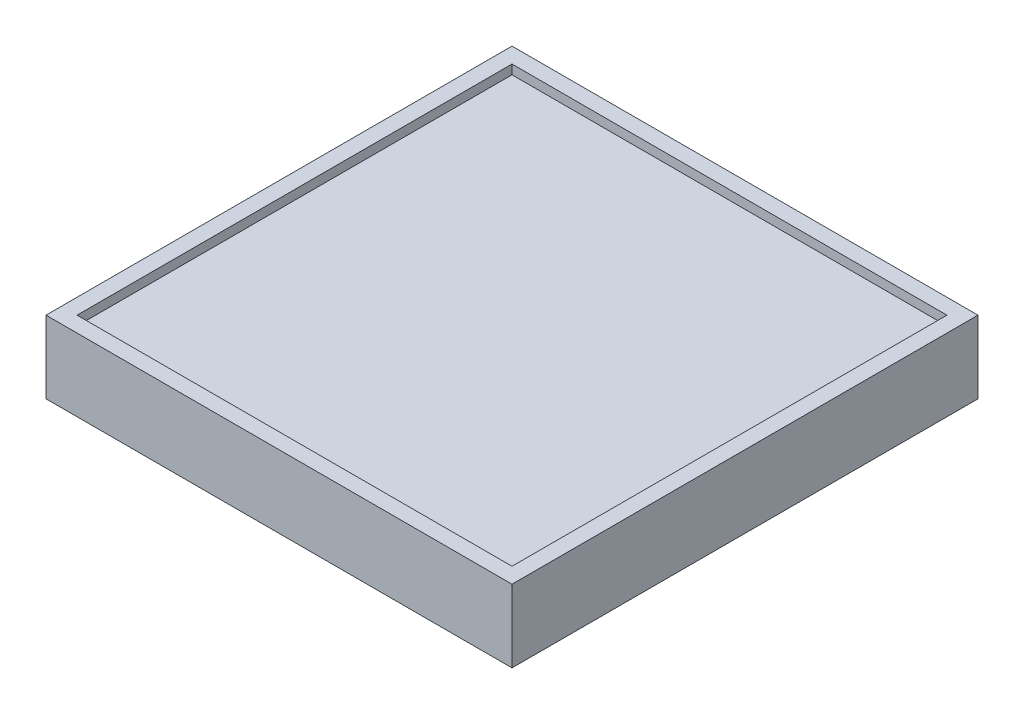
ISO-10303-21;
HEADER;
FILE_DESCRIPTION(('STEP AP214'),'2;1');
FILE_NAME('part.step','',(''),(''),'','','');
FILE_SCHEMA(('AUTOMOTIVE_DESIGN { 1 0 10303 214 1 1 1 1 }'));
ENDSEC;
DATA;
#1=APPLICATION_CONTEXT('core data for automotive mechanical design processes');
#2=APPLICATION_PROTOCOL_DEFINITION('international standard','automotive_design',2000,#1);
#3=PRODUCT_CONTEXT('',#1,'mechanical');
#4=PRODUCT('Part','Part','',(#3));
#5=PRODUCT_RELATED_PRODUCT_CATEGORY('part','',(#4));
#6=PRODUCT_DEFINITION_FORMATION('','',#4);
#7=PRODUCT_DEFINITION_CONTEXT('part definition',#1,'design');
#8=PRODUCT_DEFINITION('design','',#6,#7);
#9=PRODUCT_DEFINITION_SHAPE('','',#8);
#10=(LENGTH_UNIT() NAMED_UNIT(*) SI_UNIT(.MILLI.,.METRE.));
#11=(NAMED_UNIT(*) PLANE_ANGLE_UNIT() SI_UNIT($,.RADIAN.));
#12=(NAMED_UNIT(*) SI_UNIT($,.STERADIAN.) SOLID_ANGLE_UNIT());
#13=UNCERTAINTY_MEASURE_WITH_UNIT(LENGTH_MEASURE(1.E-05),#10,'distance_accuracy_value','');
#14=(GEOMETRIC_REPRESENTATION_CONTEXT(3) GLOBAL_UNCERTAINTY_ASSIGNED_CONTEXT((#13)) GLOBAL_UNIT_ASSIGNED_CONTEXT((#10,
#11,#12)) REPRESENTATION_CONTEXT('',''));
#15=CARTESIAN_POINT('',(0.,0.,0.));
#16=DIRECTION('',(0.,0.,1.));
#17=DIRECTION('',(1.,0.,0.));
#18=AXIS2_PLACEMENT_3D('',#15,#16,#17);
#19=CARTESIAN_POINT('',(-22.5,7.,-22.5));
#20=DIRECTION('',(1.,0.,0.));
#21=DIRECTION('',(0.,0.,-1.));
#22=AXIS2_PLACEMENT_3D('',#19,#20,#21);
#23=PLANE('',#22);
#24=DIRECTION('',(0.,0.,1.));
#25=VECTOR('',#24,1.);
#26=CARTESIAN_POINT('',(-22.5,0.,-22.5));
#27=LINE('',#26,#25);
#28=CARTESIAN_POINT('',(-22.5,0.,-22.5));
#29=VERTEX_POINT('',#28);
#30=CARTESIAN_POINT('',(-22.5,0.,22.5));
#31=VERTEX_POINT('',#30);
#32=EDGE_CURVE('E195',#29,#31,#27,.T.);
#33=ORIENTED_EDGE('',*,*,#32,.T.);
#34=DIRECTION('',(0.,-1.,0.));
#35=VECTOR('',#34,1.);
#36=CARTESIAN_POINT('',(-22.5,7.,22.5));
#37=LINE('',#36,#35);
#38=CARTESIAN_POINT('',(-22.5,7.,22.5));
#39=VERTEX_POINT('',#38);
#40=EDGE_CURVE('E11',#39,#31,#37,.T.);
#41=ORIENTED_EDGE('',*,*,#40,.F.);
#42=DIRECTION('',(0.,0.,1.));
#43=VECTOR('',#42,1.);
#44=CARTESIAN_POINT('',(-22.5,7.,-22.5));
#45=LINE('',#44,#43);
#46=CARTESIAN_POINT('',(-22.5,7.,-22.5));
#47=VERTEX_POINT('',#46);
#48=EDGE_CURVE('E201',#47,#39,#45,.T.);
#49=ORIENTED_EDGE('',*,*,#48,.F.);
#50=DIRECTION('',(0.,-1.,0.));
#51=VECTOR('',#50,1.);
#52=CARTESIAN_POINT('',(-22.5,7.,-22.5));
#53=LINE('',#52,#51);
#54=EDGE_CURVE('E207',#47,#29,#53,.T.);
#55=ORIENTED_EDGE('',*,*,#54,.T.);
#56=EDGE_LOOP('',(#33,#41,#49,#55));
#57=FACE_BOUND('',#56,.T.);
#58=ADVANCED_FACE('F34',(#57),#23,.F.);
#59=CARTESIAN_POINT('',(-22.5,7.,22.5));
#60=DIRECTION('',(0.,0.,-1.));
#61=DIRECTION('',(-1.,0.,0.));
#62=AXIS2_PLACEMENT_3D('',#59,#60,#61);
#63=PLANE('',#62);
#64=DIRECTION('',(1.,0.,0.));
#65=VECTOR('',#64,1.);
#66=CARTESIAN_POINT('',(-22.5,0.,22.5));
#67=LINE('',#66,#65);
#68=CARTESIAN_POINT('',(22.5,0.,22.5));
#69=VERTEX_POINT('',#68);
#70=EDGE_CURVE('E210',#31,#69,#67,.T.);
#71=ORIENTED_EDGE('',*,*,#70,.T.);
#72=DIRECTION('',(0.,-1.,0.));
#73=VECTOR('',#72,1.);
#74=CARTESIAN_POINT('',(22.5,7.,22.5));
#75=LINE('',#74,#73);
#76=CARTESIAN_POINT('',(22.5,7.,22.5));
#77=VERTEX_POINT('',#76);
#78=EDGE_CURVE('E41',#77,#69,#75,.T.);
#79=ORIENTED_EDGE('',*,*,#78,.F.);
#80=DIRECTION('',(1.,0.,0.));
#81=VECTOR('',#80,1.);
#82=CARTESIAN_POINT('',(-22.5,7.,22.5));
#83=LINE('',#82,#81);
#84=EDGE_CURVE('E85',#39,#77,#83,.T.);
#85=ORIENTED_EDGE('',*,*,#84,.F.);
#86=ORIENTED_EDGE('',*,*,#40,.T.);
#87=EDGE_LOOP('',(#71,#79,#85,#86));
#88=FACE_BOUND('',#87,.T.);
#89=ADVANCED_FACE('F239',(#88),#63,.F.);
#90=CARTESIAN_POINT('',(22.5,7.,-22.5));
#91=DIRECTION('',(-1.,0.,0.));
#92=DIRECTION('',(0.,0.,1.));
#93=AXIS2_PLACEMENT_3D('',#90,#91,#92);
#94=PLANE('',#93);
#95=DIRECTION('',(0.,0.,-1.));
#96=VECTOR('',#95,1.);
#97=CARTESIAN_POINT('',(22.5,0.,-22.5));
#98=LINE('',#97,#96);
#99=CARTESIAN_POINT('',(22.5,0.,-22.5));
#100=VERTEX_POINT('',#99);
#101=EDGE_CURVE('E212',#69,#100,#98,.T.);
#102=ORIENTED_EDGE('',*,*,#101,.T.);
#103=DIRECTION('',(0.,-1.,0.));
#104=VECTOR('',#103,1.);
#105=CARTESIAN_POINT('',(22.5,7.,-22.5));
#106=LINE('',#105,#104);
#107=CARTESIAN_POINT('',(22.5,7.,-22.5));
#108=VERTEX_POINT('',#107);
#109=EDGE_CURVE('E216',#108,#100,#106,.T.);
#110=ORIENTED_EDGE('',*,*,#109,.F.);
#111=DIRECTION('',(0.,0.,-1.));
#112=VECTOR('',#111,1.);
#113=CARTESIAN_POINT('',(22.5,7.,-22.5));
#114=LINE('',#113,#112);
#115=EDGE_CURVE('E204',#77,#108,#114,.T.);
#116=ORIENTED_EDGE('',*,*,#115,.F.);
#117=ORIENTED_EDGE('',*,*,#78,.T.);
#118=EDGE_LOOP('',(#102,#110,#116,#117));
#119=FACE_BOUND('',#118,.T.);
#120=ADVANCED_FACE('F221',(#119),#94,.F.);
#121=CARTESIAN_POINT('',(-22.5,7.,-22.5));
#122=DIRECTION('',(0.,0.,1.));
#123=DIRECTION('',(1.,0.,0.));
#124=AXIS2_PLACEMENT_3D('',#121,#122,#123);
#125=PLANE('',#124);
#126=DIRECTION('',(-1.,0.,0.));
#127=VECTOR('',#126,1.);
#128=CARTESIAN_POINT('',(-22.5,0.,-22.5));
#129=LINE('',#128,#127);
#130=EDGE_CURVE('E78',#100,#29,#129,.T.);
#131=ORIENTED_EDGE('',*,*,#130,.T.);
#132=ORIENTED_EDGE('',*,*,#54,.F.);
#133=DIRECTION('',(-1.,0.,0.));
#134=VECTOR('',#133,1.);
#135=CARTESIAN_POINT('',(-22.5,7.,-22.5));
#136=LINE('',#135,#134);
#137=EDGE_CURVE('E57',#108,#47,#136,.T.);
#138=ORIENTED_EDGE('',*,*,#137,.F.);
#139=ORIENTED_EDGE('',*,*,#109,.T.);
#140=EDGE_LOOP('',(#131,#132,#138,#139));
#141=FACE_BOUND('',#140,.T.);
#142=ADVANCED_FACE('F229',(#141),#125,.F.);
#143=CARTESIAN_POINT('',(0.,7.,0.));
#144=DIRECTION('',(0.,1.,0.));
#145=DIRECTION('',(0.,0.,1.));
#146=AXIS2_PLACEMENT_3D('',#143,#144,#145);
#147=PLANE('',#146);
#148=DIRECTION('',(0.,0.,1.));
#149=VECTOR('',#148,1.);
#150=CARTESIAN_POINT('',(-21.,7.,-21.));
#151=LINE('',#150,#149);
#152=CARTESIAN_POINT('',(-21.,7.,-21.));
#153=VERTEX_POINT('',#152);
#154=CARTESIAN_POINT('',(-21.,7.,21.));
#155=VERTEX_POINT('',#154);
#156=EDGE_CURVE('E48',#153,#155,#151,.T.);
#157=ORIENTED_EDGE('',*,*,#156,.F.);
#158=DIRECTION('',(-1.,0.,0.));
#159=VECTOR('',#158,1.);
#160=CARTESIAN_POINT('',(-21.,7.,-21.));
#161=LINE('',#160,#159);
#162=CARTESIAN_POINT('',(21.,7.,-21.));
#163=VERTEX_POINT('',#162);
#164=EDGE_CURVE('E177',#163,#153,#161,.T.);
#165=ORIENTED_EDGE('',*,*,#164,.F.);
#166=DIRECTION('',(0.,0.,-1.));
#167=VECTOR('',#166,1.);
#168=CARTESIAN_POINT('',(21.,7.,-21.));
#169=LINE('',#168,#167);
#170=CARTESIAN_POINT('',(21.,7.,21.));
#171=VERTEX_POINT('',#170);
#172=EDGE_CURVE('E188',#171,#163,#169,.T.);
#173=ORIENTED_EDGE('',*,*,#172,.F.);
#174=DIRECTION('',(1.,0.,0.));
#175=VECTOR('',#174,1.);
#176=CARTESIAN_POINT('',(-21.,7.,21.));
#177=LINE('',#176,#175);
#178=EDGE_CURVE('E185',#155,#171,#177,.T.);
#179=ORIENTED_EDGE('',*,*,#178,.F.);
#180=EDGE_LOOP('',(#157,#165,#173,#179));
#181=FACE_BOUND('',#180,.T.);
#182=ORIENTED_EDGE('',*,*,#48,.T.);
#183=ORIENTED_EDGE('',*,*,#84,.T.);
#184=ORIENTED_EDGE('',*,*,#115,.T.);
#185=ORIENTED_EDGE('',*,*,#137,.T.);
#186=EDGE_LOOP('',(#182,#183,#184,#185));
#187=FACE_BOUND('',#186,.T.);
#188=ADVANCED_FACE('F231',(#181,#187),#147,.T.);
#189=CARTESIAN_POINT('',(0.,0.,0.));
#190=DIRECTION('',(0.,1.,0.));
#191=DIRECTION('',(0.,0.,1.));
#192=AXIS2_PLACEMENT_3D('',#189,#190,#191);
#193=PLANE('',#192);
#194=ORIENTED_EDGE('',*,*,#32,.F.);
#195=ORIENTED_EDGE('',*,*,#130,.F.);
#196=ORIENTED_EDGE('',*,*,#101,.F.);
#197=ORIENTED_EDGE('',*,*,#70,.F.);
#198=EDGE_LOOP('',(#194,#195,#196,#197));
#199=FACE_BOUND('',#198,.T.);
#200=ADVANCED_FACE('F225',(#199),#193,.F.);
#201=CARTESIAN_POINT('',(-21.,6.1,-21.));
#202=DIRECTION('',(-1.,0.,0.));
#203=DIRECTION('',(0.,0.,1.));
#204=AXIS2_PLACEMENT_3D('',#201,#202,#203);
#205=PLANE('',#204);
#206=ORIENTED_EDGE('',*,*,#156,.T.);
#207=DIRECTION('',(0.,1.,0.));
#208=VECTOR('',#207,1.);
#209=CARTESIAN_POINT('',(-21.,6.1,21.));
#210=LINE('',#209,#208);
#211=CARTESIAN_POINT('',(-21.,6.1,21.));
#212=VERTEX_POINT('',#211);
#213=EDGE_CURVE('E183',#212,#155,#210,.T.);
#214=ORIENTED_EDGE('',*,*,#213,.F.);
#215=DIRECTION('',(0.,0.,1.));
#216=VECTOR('',#215,1.);
#217=CARTESIAN_POINT('',(-21.,6.1,-21.));
#218=LINE('',#217,#216);
#219=CARTESIAN_POINT('',(-21.,6.1,-21.));
#220=VERTEX_POINT('',#219);
#221=EDGE_CURVE('E174',#220,#212,#218,.T.);
#222=ORIENTED_EDGE('',*,*,#221,.F.);
#223=DIRECTION('',(0.,1.,0.));
#224=VECTOR('',#223,1.);
#225=CARTESIAN_POINT('',(-21.,6.1,-21.));
#226=LINE('',#225,#224);
#227=EDGE_CURVE('E193',#220,#153,#226,.T.);
#228=ORIENTED_EDGE('',*,*,#227,.T.);
#229=EDGE_LOOP('',(#206,#214,#222,#228));
#230=FACE_BOUND('',#229,.T.);
#231=ADVANCED_FACE('F266',(#230),#205,.F.);
#232=CARTESIAN_POINT('',(-21.,6.1,-21.));
#233=DIRECTION('',(0.,0.,-1.));
#234=DIRECTION('',(-1.,0.,0.));
#235=AXIS2_PLACEMENT_3D('',#232,#233,#234);
#236=PLANE('',#235);
#237=ORIENTED_EDGE('',*,*,#164,.T.);
#238=ORIENTED_EDGE('',*,*,#227,.F.);
#239=DIRECTION('',(-1.,0.,0.));
#240=VECTOR('',#239,1.);
#241=CARTESIAN_POINT('',(-21.,6.1,-21.));
#242=LINE('',#241,#240);
#243=CARTESIAN_POINT('',(21.,6.1,-21.));
#244=VERTEX_POINT('',#243);
#245=EDGE_CURVE('E181',#244,#220,#242,.T.);
#246=ORIENTED_EDGE('',*,*,#245,.F.);
#247=DIRECTION('',(0.,1.,0.));
#248=VECTOR('',#247,1.);
#249=CARTESIAN_POINT('',(21.,6.1,-21.));
#250=LINE('',#249,#248);
#251=EDGE_CURVE('E196',#244,#163,#250,.T.);
#252=ORIENTED_EDGE('',*,*,#251,.T.);
#253=EDGE_LOOP('',(#237,#238,#246,#252));
#254=FACE_BOUND('',#253,.T.);
#255=ADVANCED_FACE('F279',(#254),#236,.F.);
#256=CARTESIAN_POINT('',(21.,6.1,-21.));
#257=DIRECTION('',(1.,0.,0.));
#258=DIRECTION('',(0.,0.,-1.));
#259=AXIS2_PLACEMENT_3D('',#256,#257,#258);
#260=PLANE('',#259);
#261=ORIENTED_EDGE('',*,*,#172,.T.);
#262=ORIENTED_EDGE('',*,*,#251,.F.);
#263=DIRECTION('',(0.,0.,-1.));
#264=VECTOR('',#263,1.);
#265=CARTESIAN_POINT('',(21.,6.1,-21.));
#266=LINE('',#265,#264);
#267=CARTESIAN_POINT('',(21.,6.1,21.));
#268=VERTEX_POINT('',#267);
#269=EDGE_CURVE('E179',#268,#244,#266,.T.);
#270=ORIENTED_EDGE('',*,*,#269,.F.);
#271=DIRECTION('',(0.,1.,0.));
#272=VECTOR('',#271,1.);
#273=CARTESIAN_POINT('',(21.,6.1,21.));
#274=LINE('',#273,#272);
#275=EDGE_CURVE('E198',#268,#171,#274,.T.);
#276=ORIENTED_EDGE('',*,*,#275,.T.);
#277=EDGE_LOOP('',(#261,#262,#270,#276));
#278=FACE_BOUND('',#277,.T.);
#279=ADVANCED_FACE('F288',(#278),#260,.F.);
#280=CARTESIAN_POINT('',(-21.,6.1,21.));
#281=DIRECTION('',(0.,0.,1.));
#282=DIRECTION('',(1.,0.,0.));
#283=AXIS2_PLACEMENT_3D('',#280,#281,#282);
#284=PLANE('',#283);
#285=ORIENTED_EDGE('',*,*,#178,.T.);
#286=ORIENTED_EDGE('',*,*,#275,.F.);
#287=DIRECTION('',(1.,0.,0.));
#288=VECTOR('',#287,1.);
#289=CARTESIAN_POINT('',(-21.,6.1,21.));
#290=LINE('',#289,#288);
#291=EDGE_CURVE('E176',#212,#268,#290,.T.);
#292=ORIENTED_EDGE('',*,*,#291,.F.);
#293=ORIENTED_EDGE('',*,*,#213,.T.);
#294=EDGE_LOOP('',(#285,#286,#292,#293));
#295=FACE_BOUND('',#294,.T.);
#296=ADVANCED_FACE('F298',(#295),#284,.F.);
#297=CARTESIAN_POINT('',(-21.75,5.4,-21.75));
#298=DIRECTION('',(-1.,0.,0.));
#299=DIRECTION('',(0.,0.,1.));
#300=AXIS2_PLACEMENT_3D('',#297,#298,#299);
#301=PLANE('',#300);
#302=DIRECTION('',(0.,0.,1.));
#303=VECTOR('',#302,1.);
#304=CARTESIAN_POINT('',(-21.75,6.1,-21.75));
#305=LINE('',#304,#303);
#306=CARTESIAN_POINT('',(-21.75,6.1,-21.75));
#307=VERTEX_POINT('',#306);
#308=CARTESIAN_POINT('',(-21.75,6.1,21.75));
#309=VERTEX_POINT('',#308);
#310=EDGE_CURVE('E139',#307,#309,#305,.T.);
#311=ORIENTED_EDGE('',*,*,#310,.T.);
#312=DIRECTION('',(0.,1.,0.));
#313=VECTOR('',#312,1.);
#314=CARTESIAN_POINT('',(-21.75,5.4,21.75));
#315=LINE('',#314,#313);
#316=CARTESIAN_POINT('',(-21.75,5.4,21.75));
#317=VERTEX_POINT('',#316);
#318=EDGE_CURVE('E132',#317,#309,#315,.T.);
#319=ORIENTED_EDGE('',*,*,#318,.F.);
#320=DIRECTION('',(0.,0.,1.));
#321=VECTOR('',#320,1.);
#322=CARTESIAN_POINT('',(-21.75,5.4,-21.75));
#323=LINE('',#322,#321);
#324=CARTESIAN_POINT('',(-21.75,5.4,-21.75));
#325=VERTEX_POINT('',#324);
#326=EDGE_CURVE('E136',#325,#317,#323,.T.);
#327=ORIENTED_EDGE('',*,*,#326,.F.);
#328=DIRECTION('',(0.,1.,0.));
#329=VECTOR('',#328,1.);
#330=CARTESIAN_POINT('',(-21.75,5.4,-21.75));
#331=LINE('',#330,#329);
#332=EDGE_CURVE('E169',#325,#307,#331,.T.);
#333=ORIENTED_EDGE('',*,*,#332,.T.);
#334=EDGE_LOOP('',(#311,#319,#327,#333));
#335=FACE_BOUND('',#334,.T.);
#336=ADVANCED_FACE('F134',(#335),#301,.F.);
#337=CARTESIAN_POINT('',(-21.75,5.4,-21.75));
#338=DIRECTION('',(0.,0.,-1.));
#339=DIRECTION('',(-1.,0.,0.));
#340=AXIS2_PLACEMENT_3D('',#337,#338,#339);
#341=PLANE('',#340);
#342=DIRECTION('',(-1.,0.,0.));
#343=VECTOR('',#342,1.);
#344=CARTESIAN_POINT('',(-21.75,6.1,-21.75));
#345=LINE('',#344,#343);
#346=CARTESIAN_POINT('',(21.75,6.1,-21.75));
#347=VERTEX_POINT('',#346);
#348=EDGE_CURVE('E156',#347,#307,#345,.T.);
#349=ORIENTED_EDGE('',*,*,#348,.T.);
#350=ORIENTED_EDGE('',*,*,#332,.F.);
#351=DIRECTION('',(-1.,0.,0.));
#352=VECTOR('',#351,1.);
#353=CARTESIAN_POINT('',(-21.75,5.4,-21.75));
#354=LINE('',#353,#352);
#355=CARTESIAN_POINT('',(21.75,5.4,-21.75));
#356=VERTEX_POINT('',#355);
#357=EDGE_CURVE('E144',#356,#325,#354,.T.);
#358=ORIENTED_EDGE('',*,*,#357,.F.);
#359=DIRECTION('',(0.,1.,0.));
#360=VECTOR('',#359,1.);
#361=CARTESIAN_POINT('',(21.75,5.4,-21.75));
#362=LINE('',#361,#360);
#363=EDGE_CURVE('E171',#356,#347,#362,.T.);
#364=ORIENTED_EDGE('',*,*,#363,.T.);
#365=EDGE_LOOP('',(#349,#350,#358,#364));
#366=FACE_BOUND('',#365,.T.);
#367=ADVANCED_FACE('F317',(#366),#341,.F.);
#368=CARTESIAN_POINT('',(21.75,5.4,-21.75));
#369=DIRECTION('',(1.,0.,0.));
#370=DIRECTION('',(0.,0.,-1.));
#371=AXIS2_PLACEMENT_3D('',#368,#369,#370);
#372=PLANE('',#371);
#373=DIRECTION('',(0.,0.,-1.));
#374=VECTOR('',#373,1.);
#375=CARTESIAN_POINT('',(21.75,6.1,-21.75));
#376=LINE('',#375,#374);
#377=CARTESIAN_POINT('',(21.75,6.1,21.75));
#378=VERTEX_POINT('',#377);
#379=EDGE_CURVE('E159',#378,#347,#376,.T.);
#380=ORIENTED_EDGE('',*,*,#379,.T.);
#381=ORIENTED_EDGE('',*,*,#363,.F.);
#382=DIRECTION('',(0.,0.,-1.));
#383=VECTOR('',#382,1.);
#384=CARTESIAN_POINT('',(21.75,5.4,-21.75));
#385=LINE('',#384,#383);
#386=CARTESIAN_POINT('',(21.75,5.4,21.75));
#387=VERTEX_POINT('',#386);
#388=EDGE_CURVE('E152',#387,#356,#385,.T.);
#389=ORIENTED_EDGE('',*,*,#388,.F.);
#390=DIRECTION('',(0.,1.,0.));
#391=VECTOR('',#390,1.);
#392=CARTESIAN_POINT('',(21.75,5.4,21.75));
#393=LINE('',#392,#391);
#394=EDGE_CURVE('E143',#387,#378,#393,.T.);
#395=ORIENTED_EDGE('',*,*,#394,.T.);
#396=EDGE_LOOP('',(#380,#381,#389,#395));
#397=FACE_BOUND('',#396,.T.);
#398=ADVANCED_FACE('F326',(#397),#372,.F.);
#399=CARTESIAN_POINT('',(-21.75,5.4,21.75));
#400=DIRECTION('',(0.,0.,1.));
#401=DIRECTION('',(1.,0.,0.));
#402=AXIS2_PLACEMENT_3D('',#399,#400,#401);
#403=PLANE('',#402);
#404=DIRECTION('',(1.,0.,0.));
#405=VECTOR('',#404,1.);
#406=CARTESIAN_POINT('',(-21.75,6.1,21.75));
#407=LINE('',#406,#405);
#408=EDGE_CURVE('E165',#309,#378,#407,.T.);
#409=ORIENTED_EDGE('',*,*,#408,.T.);
#410=ORIENTED_EDGE('',*,*,#394,.F.);
#411=DIRECTION('',(1.,0.,0.));
#412=VECTOR('',#411,1.);
#413=CARTESIAN_POINT('',(-21.75,5.4,21.75));
#414=LINE('',#413,#412);
#415=EDGE_CURVE('E147',#317,#387,#414,.T.);
#416=ORIENTED_EDGE('',*,*,#415,.F.);
#417=ORIENTED_EDGE('',*,*,#318,.T.);
#418=EDGE_LOOP('',(#409,#410,#416,#417));
#419=FACE_BOUND('',#418,.T.);
#420=ADVANCED_FACE('F148',(#419),#403,.F.);
#421=CARTESIAN_POINT('',(0.,5.4,0.));
#422=DIRECTION('',(0.,1.,0.));
#423=DIRECTION('',(0.,0.,1.));
#424=AXIS2_PLACEMENT_3D('',#421,#422,#423);
#425=PLANE('',#424);
#426=ORIENTED_EDGE('',*,*,#326,.T.);
#427=ORIENTED_EDGE('',*,*,#415,.T.);
#428=ORIENTED_EDGE('',*,*,#388,.T.);
#429=ORIENTED_EDGE('',*,*,#357,.T.);
#430=EDGE_LOOP('',(#426,#427,#428,#429));
#431=FACE_BOUND('',#430,.T.);
#432=ADVANCED_FACE('F154',(#431),#425,.T.);
#433=CARTESIAN_POINT('',(0.,6.1,0.));
#434=DIRECTION('',(0.,1.,0.));
#435=DIRECTION('',(0.,0.,1.));
#436=AXIS2_PLACEMENT_3D('',#433,#434,#435);
#437=PLANE('',#436);
#438=ORIENTED_EDGE('',*,*,#221,.T.);
#439=ORIENTED_EDGE('',*,*,#291,.T.);
#440=ORIENTED_EDGE('',*,*,#269,.T.);
#441=ORIENTED_EDGE('',*,*,#245,.T.);
#442=EDGE_LOOP('',(#438,#439,#440,#441));
#443=FACE_BOUND('',#442,.T.);
#444=ORIENTED_EDGE('',*,*,#310,.F.);
#445=ORIENTED_EDGE('',*,*,#348,.F.);
#446=ORIENTED_EDGE('',*,*,#379,.F.);
#447=ORIENTED_EDGE('',*,*,#408,.F.);
#448=EDGE_LOOP('',(#444,#445,#446,#447));
#449=FACE_BOUND('',#448,.T.);
#450=ADVANCED_FACE('F353',(#443,#449),#437,.F.);
#451=CLOSED_SHELL('',(#58,#89,#120,#142,#188,#200,#231,#255,#279,#296,#336,#367,#398,#420,#432,#450));
#452=MANIFOLD_SOLID_BREP('B2',#451);
#453=ADVANCED_BREP_SHAPE_REPRESENTATION('',(#18,#452),#14);
#454=SHAPE_DEFINITION_REPRESENTATION(#9,#453);
ENDSEC;
END-ISO-10303-21;
